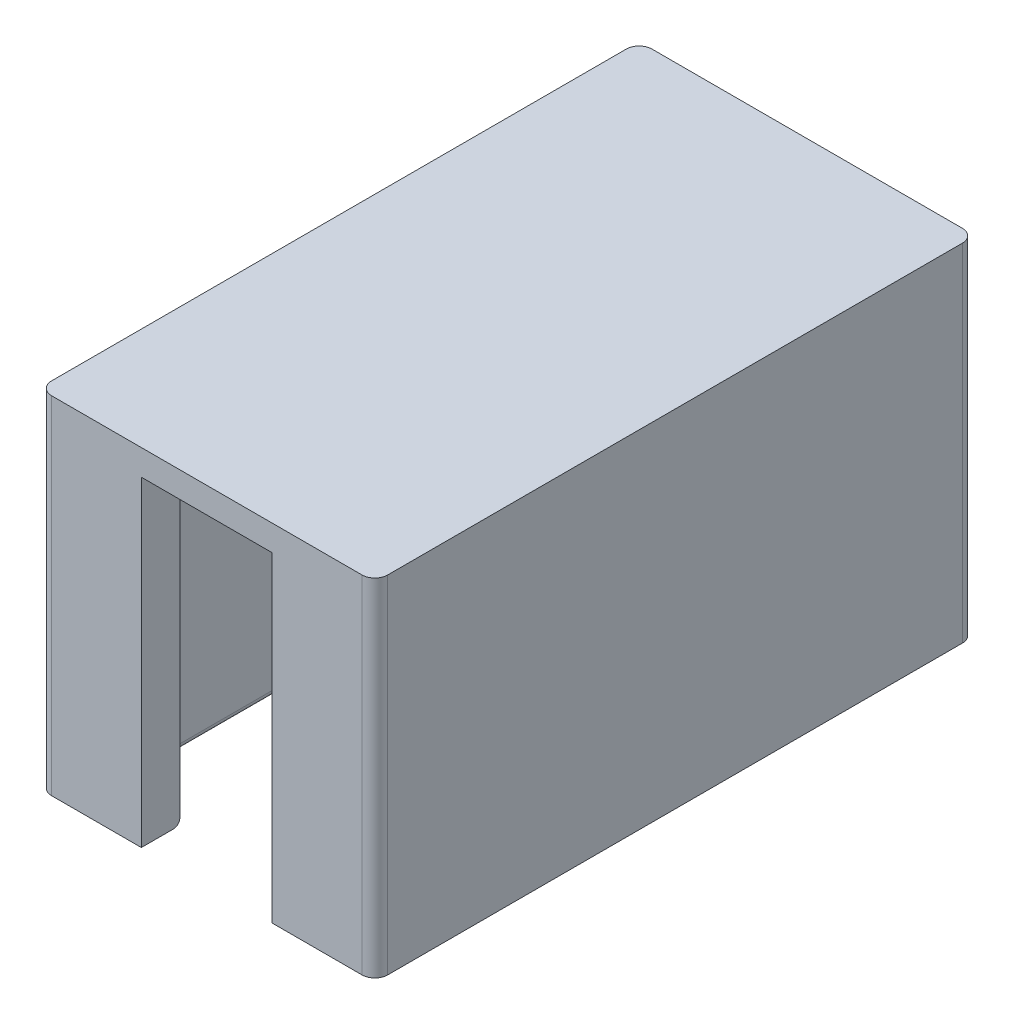
ISO-10303-21;
HEADER;
FILE_DESCRIPTION(('STEP AP214'),'2;1');
FILE_NAME('part.step','',(''),(''),'','','');
FILE_SCHEMA(('AUTOMOTIVE_DESIGN { 1 0 10303 214 1 1 1 1 }'));
ENDSEC;
DATA;
#1=APPLICATION_CONTEXT('core data for automotive mechanical design processes');
#2=APPLICATION_PROTOCOL_DEFINITION('international standard','automotive_design',2000,#1);
#3=PRODUCT_CONTEXT('',#1,'mechanical');
#4=PRODUCT('Part','Part','',(#3));
#5=PRODUCT_RELATED_PRODUCT_CATEGORY('part','',(#4));
#6=PRODUCT_DEFINITION_FORMATION('','',#4);
#7=PRODUCT_DEFINITION_CONTEXT('part definition',#1,'design');
#8=PRODUCT_DEFINITION('design','',#6,#7);
#9=PRODUCT_DEFINITION_SHAPE('','',#8);
#10=(LENGTH_UNIT() NAMED_UNIT(*) SI_UNIT(.MILLI.,.METRE.));
#11=(NAMED_UNIT(*) PLANE_ANGLE_UNIT() SI_UNIT($,.RADIAN.));
#12=(NAMED_UNIT(*) SI_UNIT($,.STERADIAN.) SOLID_ANGLE_UNIT());
#13=UNCERTAINTY_MEASURE_WITH_UNIT(LENGTH_MEASURE(1.E-05),#10,'distance_accuracy_value','');
#14=(GEOMETRIC_REPRESENTATION_CONTEXT(3) GLOBAL_UNCERTAINTY_ASSIGNED_CONTEXT((#13)) GLOBAL_UNIT_ASSIGNED_CONTEXT((#10,
#11,#12)) REPRESENTATION_CONTEXT('',''));
#15=CARTESIAN_POINT('',(0.,0.,0.));
#16=DIRECTION('',(0.,0.,1.));
#17=DIRECTION('',(1.,0.,0.));
#18=AXIS2_PLACEMENT_3D('',#15,#16,#17);
#19=CARTESIAN_POINT('',(3.,25.,-3.));
#20=DIRECTION('',(0.,0.,-1.));
#21=DIRECTION('',(-1.,0.,0.));
#22=AXIS2_PLACEMENT_3D('',#19,#20,#21);
#23=PLANE('',#22);
#24=DIRECTION('',(0.,-1.,0.));
#25=VECTOR('',#24,1.);
#26=CARTESIAN_POINT('',(3.,25.,-3.));
#27=LINE('',#26,#25);
#28=CARTESIAN_POINT('',(3.,24.5,-3.));
#29=VERTEX_POINT('',#28);
#30=CARTESIAN_POINT('',(3.,0.5,-3.));
#31=VERTEX_POINT('',#30);
#32=EDGE_CURVE('E386',#29,#31,#27,.T.);
#33=ORIENTED_EDGE('',*,*,#32,.F.);
#34=DIRECTION('',(1.,0.,0.));
#35=VECTOR('',#34,1.);
#36=CARTESIAN_POINT('',(8.,24.5,-3.));
#37=LINE('',#36,#35);
#38=CARTESIAN_POINT('',(8.,24.5,-3.));
#39=VERTEX_POINT('',#38);
#40=EDGE_CURVE('E197',#29,#39,#37,.T.);
#41=ORIENTED_EDGE('',*,*,#40,.T.);
#42=DIRECTION('',(0.,-1.,0.));
#43=VECTOR('',#42,1.);
#44=CARTESIAN_POINT('',(8.,25.,-3.));
#45=LINE('',#44,#43);
#46=CARTESIAN_POINT('',(8.,0.5,-3.));
#47=VERTEX_POINT('',#46);
#48=EDGE_CURVE('E327',#39,#47,#45,.T.);
#49=ORIENTED_EDGE('',*,*,#48,.T.);
#50=DIRECTION('',(1.,0.,0.));
#51=VECTOR('',#50,1.);
#52=CARTESIAN_POINT('',(3.,0.5,-3.));
#53=LINE('',#52,#51);
#54=EDGE_CURVE('E333',#47,#31,#53,.F.);
#55=ORIENTED_EDGE('',*,*,#54,.T.);
#56=EDGE_LOOP('',(#33,#41,#49,#55));
#57=FACE_BOUND('',#56,.T.);
#58=ADVANCED_FACE('F40',(#57),#23,.T.);
#59=CARTESIAN_POINT('',(0.,0.,0.));
#60=DIRECTION('',(0.,-1.,0.));
#61=DIRECTION('',(0.,0.,-1.));
#62=AXIS2_PLACEMENT_3D('',#59,#60,#61);
#63=PLANE('',#62);
#64=DIRECTION('',(-1.,0.,0.));
#65=VECTOR('',#64,1.);
#66=CARTESIAN_POINT('',(0.,0.,-46.8));
#67=LINE('',#66,#65);
#68=CARTESIAN_POINT('',(25.2,0.,-46.8));
#69=VERTEX_POINT('',#68);
#70=CARTESIAN_POINT('',(1.,0.,-46.8));
#71=VERTEX_POINT('',#70);
#72=EDGE_CURVE('E319',#69,#71,#67,.T.);
#73=ORIENTED_EDGE('',*,*,#72,.F.);
#74=CARTESIAN_POINT('',(25.2,0.,-45.8));
#75=DIRECTION('',(0.,-1.,0.));
#76=DIRECTION('',(0.,0.,-1.));
#77=AXIS2_PLACEMENT_3D('',#74,#75,#76);
#78=CIRCLE('',#77,1.);
#79=CARTESIAN_POINT('',(26.2,0.,-45.8));
#80=VERTEX_POINT('',#79);
#81=EDGE_CURVE('E280',#69,#80,#78,.T.);
#82=ORIENTED_EDGE('',*,*,#81,.T.);
#83=DIRECTION('',(0.,0.,-1.));
#84=VECTOR('',#83,1.);
#85=CARTESIAN_POINT('',(26.2,0.,0.));
#86=LINE('',#85,#84);
#87=CARTESIAN_POINT('',(26.2,0.,-1.));
#88=VERTEX_POINT('',#87);
#89=EDGE_CURVE('E315',#88,#80,#86,.T.);
#90=ORIENTED_EDGE('',*,*,#89,.F.);
#91=CARTESIAN_POINT('',(25.2,0.,-1.));
#92=DIRECTION('',(0.,-1.,0.));
#93=DIRECTION('',(0.,0.,-1.));
#94=AXIS2_PLACEMENT_3D('',#91,#92,#93);
#95=CIRCLE('',#94,1.);
#96=CARTESIAN_POINT('',(25.2,0.,0.));
#97=VERTEX_POINT('',#96);
#98=EDGE_CURVE('E276',#88,#97,#95,.T.);
#99=ORIENTED_EDGE('',*,*,#98,.T.);
#100=DIRECTION('',(1.,0.,0.));
#101=VECTOR('',#100,1.);
#102=CARTESIAN_POINT('',(0.,0.,0.));
#103=LINE('',#102,#101);
#104=CARTESIAN_POINT('',(18.2,0.,0.));
#105=VERTEX_POINT('',#104);
#106=EDGE_CURVE('E316',#105,#97,#103,.T.);
#107=ORIENTED_EDGE('',*,*,#106,.F.);
#108=DIRECTION('',(0.,0.,1.));
#109=VECTOR('',#108,1.);
#110=CARTESIAN_POINT('',(18.2,0.,-10.));
#111=LINE('',#110,#109);
#112=CARTESIAN_POINT('',(18.2,0.,-2.5));
#113=VERTEX_POINT('',#112);
#114=EDGE_CURVE('E363',#113,#105,#111,.T.);
#115=ORIENTED_EDGE('',*,*,#114,.F.);
#116=DIRECTION('',(1.,0.,0.));
#117=VECTOR('',#116,1.);
#118=CARTESIAN_POINT('',(0.,0.,-2.5));
#119=LINE('',#118,#117);
#120=CARTESIAN_POINT('',(23.7,0.,-2.5));
#121=VERTEX_POINT('',#120);
#122=EDGE_CURVE('E238',#113,#121,#119,.T.);
#123=ORIENTED_EDGE('',*,*,#122,.T.);
#124=DIRECTION('',(0.,0.,-1.));
#125=VECTOR('',#124,1.);
#126=CARTESIAN_POINT('',(23.7,0.,0.));
#127=LINE('',#126,#125);
#128=CARTESIAN_POINT('',(23.7,0.,-44.3));
#129=VERTEX_POINT('',#128);
#130=EDGE_CURVE('E240',#121,#129,#127,.T.);
#131=ORIENTED_EDGE('',*,*,#130,.T.);
#132=DIRECTION('',(-1.,0.,0.));
#133=VECTOR('',#132,1.);
#134=CARTESIAN_POINT('',(0.,0.,-44.3));
#135=LINE('',#134,#133);
#136=CARTESIAN_POINT('',(2.5,0.,-44.3));
#137=VERTEX_POINT('',#136);
#138=EDGE_CURVE('E242',#129,#137,#135,.T.);
#139=ORIENTED_EDGE('',*,*,#138,.T.);
#140=DIRECTION('',(0.,0.,1.));
#141=VECTOR('',#140,1.);
#142=CARTESIAN_POINT('',(2.5,0.,0.));
#143=LINE('',#142,#141);
#144=CARTESIAN_POINT('',(2.5,0.,-2.5));
#145=VERTEX_POINT('',#144);
#146=EDGE_CURVE('E244',#137,#145,#143,.T.);
#147=ORIENTED_EDGE('',*,*,#146,.T.);
#148=DIRECTION('',(1.,0.,0.));
#149=VECTOR('',#148,1.);
#150=CARTESIAN_POINT('',(0.,0.,-2.5));
#151=LINE('',#150,#149);
#152=CARTESIAN_POINT('',(8.,0.,-2.5));
#153=VERTEX_POINT('',#152);
#154=EDGE_CURVE('E246',#145,#153,#151,.T.);
#155=ORIENTED_EDGE('',*,*,#154,.T.);
#156=DIRECTION('',(0.,0.,1.));
#157=VECTOR('',#156,1.);
#158=CARTESIAN_POINT('',(8.,0.,-10.));
#159=LINE('',#158,#157);
#160=CARTESIAN_POINT('',(8.,0.,0.));
#161=VERTEX_POINT('',#160);
#162=EDGE_CURVE('E313',#153,#161,#159,.T.);
#163=ORIENTED_EDGE('',*,*,#162,.T.);
#164=CARTESIAN_POINT('',(1.,0.,0.));
#165=VERTEX_POINT('',#164);
#166=EDGE_CURVE('E303',#165,#161,#103,.T.);
#167=ORIENTED_EDGE('',*,*,#166,.F.);
#168=CARTESIAN_POINT('',(1.,0.,-1.));
#169=DIRECTION('',(0.,-1.,0.));
#170=DIRECTION('',(0.,0.,-1.));
#171=AXIS2_PLACEMENT_3D('',#168,#169,#170);
#172=CIRCLE('',#171,1.);
#173=CARTESIAN_POINT('',(0.,0.,-1.));
#174=VERTEX_POINT('',#173);
#175=EDGE_CURVE('E274',#165,#174,#172,.T.);
#176=ORIENTED_EDGE('',*,*,#175,.T.);
#177=DIRECTION('',(0.,0.,1.));
#178=VECTOR('',#177,1.);
#179=CARTESIAN_POINT('',(0.,0.,0.));
#180=LINE('',#179,#178);
#181=CARTESIAN_POINT('',(0.,0.,-45.8));
#182=VERTEX_POINT('',#181);
#183=EDGE_CURVE('E321',#182,#174,#180,.T.);
#184=ORIENTED_EDGE('',*,*,#183,.F.);
#185=CARTESIAN_POINT('',(1.,0.,-45.8));
#186=DIRECTION('',(0.,-1.,0.));
#187=DIRECTION('',(0.,0.,-1.));
#188=AXIS2_PLACEMENT_3D('',#185,#186,#187);
#189=CIRCLE('',#188,1.);
#190=EDGE_CURVE('E278',#182,#71,#189,.T.);
#191=ORIENTED_EDGE('',*,*,#190,.T.);
#192=EDGE_LOOP('',(#73,#82,#90,#99,#107,#115,#123,#131,#139,#147,#155,#163,#167,#176,#184,#191));
#193=FACE_BOUND('',#192,.T.);
#194=ADVANCED_FACE('F309',(#193),#63,.T.);
#195=CARTESIAN_POINT('',(0.,25.,0.));
#196=DIRECTION('',(1.,0.,0.));
#197=DIRECTION('',(0.,0.,-1.));
#198=AXIS2_PLACEMENT_3D('',#195,#196,#197);
#199=PLANE('',#198);
#200=DIRECTION('',(0.,0.,1.));
#201=VECTOR('',#200,1.);
#202=CARTESIAN_POINT('',(0.,27.,0.));
#203=LINE('',#202,#201);
#204=CARTESIAN_POINT('',(0.,27.,-45.8));
#205=VERTEX_POINT('',#204);
#206=CARTESIAN_POINT('',(0.,27.,-1.));
#207=VERTEX_POINT('',#206);
#208=EDGE_CURVE('E368',#205,#207,#203,.T.);
#209=ORIENTED_EDGE('',*,*,#208,.F.);
#210=DIRECTION('',(0.,-1.,0.));
#211=VECTOR('',#210,1.);
#212=CARTESIAN_POINT('',(0.,25.,-45.8));
#213=LINE('',#212,#211);
#214=EDGE_CURVE('E296',#205,#182,#213,.T.);
#215=ORIENTED_EDGE('',*,*,#214,.T.);
#216=ORIENTED_EDGE('',*,*,#183,.T.);
#217=DIRECTION('',(0.,-1.,0.));
#218=VECTOR('',#217,1.);
#219=CARTESIAN_POINT('',(0.,25.,-1.));
#220=LINE('',#219,#218);
#221=EDGE_CURVE('E294',#174,#207,#220,.F.);
#222=ORIENTED_EDGE('',*,*,#221,.T.);
#223=EDGE_LOOP('',(#209,#215,#216,#222));
#224=FACE_BOUND('',#223,.T.);
#225=ADVANCED_FACE('F394',(#224),#199,.F.);
#226=CARTESIAN_POINT('',(0.,25.,0.));
#227=DIRECTION('',(0.,0.,-1.));
#228=DIRECTION('',(-1.,0.,0.));
#229=AXIS2_PLACEMENT_3D('',#226,#227,#228);
#230=PLANE('',#229);
#231=ORIENTED_EDGE('',*,*,#106,.T.);
#232=DIRECTION('',(0.,-1.,0.));
#233=VECTOR('',#232,1.);
#234=CARTESIAN_POINT('',(25.2,25.,0.));
#235=LINE('',#234,#233);
#236=CARTESIAN_POINT('',(25.2,27.,0.));
#237=VERTEX_POINT('',#236);
#238=EDGE_CURVE('E11',#97,#237,#235,.F.);
#239=ORIENTED_EDGE('',*,*,#238,.T.);
#240=DIRECTION('',(1.,0.,0.));
#241=VECTOR('',#240,1.);
#242=CARTESIAN_POINT('',(0.,27.,0.));
#243=LINE('',#242,#241);
#244=CARTESIAN_POINT('',(1.,27.,0.));
#245=VERTEX_POINT('',#244);
#246=EDGE_CURVE('E305',#245,#237,#243,.T.);
#247=ORIENTED_EDGE('',*,*,#246,.F.);
#248=DIRECTION('',(0.,-1.,0.));
#249=VECTOR('',#248,1.);
#250=CARTESIAN_POINT('',(1.,25.,0.));
#251=LINE('',#250,#249);
#252=EDGE_CURVE('E48',#245,#165,#251,.T.);
#253=ORIENTED_EDGE('',*,*,#252,.T.);
#254=ORIENTED_EDGE('',*,*,#166,.T.);
#255=DIRECTION('',(0.,1.,0.));
#256=VECTOR('',#255,1.);
#257=CARTESIAN_POINT('',(8.,0.,0.));
#258=LINE('',#257,#256);
#259=CARTESIAN_POINT('',(8.,25.,0.));
#260=VERTEX_POINT('',#259);
#261=EDGE_CURVE('E367',#161,#260,#258,.T.);
#262=ORIENTED_EDGE('',*,*,#261,.T.);
#263=DIRECTION('',(1.,0.,0.));
#264=VECTOR('',#263,1.);
#265=CARTESIAN_POINT('',(0.,25.,0.));
#266=LINE('',#265,#264);
#267=CARTESIAN_POINT('',(18.2,25.,0.));
#268=VERTEX_POINT('',#267);
#269=EDGE_CURVE('E360',#260,#268,#266,.T.);
#270=ORIENTED_EDGE('',*,*,#269,.T.);
#271=DIRECTION('',(0.,1.,0.));
#272=VECTOR('',#271,1.);
#273=CARTESIAN_POINT('',(18.2,0.,0.));
#274=LINE('',#273,#272);
#275=EDGE_CURVE('E257',#105,#268,#274,.T.);
#276=ORIENTED_EDGE('',*,*,#275,.F.);
#277=EDGE_LOOP('',(#231,#239,#247,#253,#254,#262,#270,#276));
#278=FACE_BOUND('',#277,.T.);
#279=ADVANCED_FACE('F301',(#278),#230,.F.);
#280=CARTESIAN_POINT('',(26.2,25.,0.));
#281=DIRECTION('',(-1.,0.,0.));
#282=DIRECTION('',(0.,0.,1.));
#283=AXIS2_PLACEMENT_3D('',#280,#281,#282);
#284=PLANE('',#283);
#285=ORIENTED_EDGE('',*,*,#89,.T.);
#286=DIRECTION('',(0.,-1.,0.));
#287=VECTOR('',#286,1.);
#288=CARTESIAN_POINT('',(26.2,25.,-45.8));
#289=LINE('',#288,#287);
#290=CARTESIAN_POINT('',(26.2,27.,-45.8));
#291=VERTEX_POINT('',#290);
#292=EDGE_CURVE('E285',#80,#291,#289,.F.);
#293=ORIENTED_EDGE('',*,*,#292,.T.);
#294=DIRECTION('',(0.,0.,-1.));
#295=VECTOR('',#294,1.);
#296=CARTESIAN_POINT('',(26.2,27.,0.));
#297=LINE('',#296,#295);
#298=CARTESIAN_POINT('',(26.2,27.,-1.));
#299=VERTEX_POINT('',#298);
#300=EDGE_CURVE('E442',#299,#291,#297,.T.);
#301=ORIENTED_EDGE('',*,*,#300,.F.);
#302=DIRECTION('',(0.,-1.,0.));
#303=VECTOR('',#302,1.);
#304=CARTESIAN_POINT('',(26.2,25.,-1.));
#305=LINE('',#304,#303);
#306=EDGE_CURVE('E282',#299,#88,#305,.T.);
#307=ORIENTED_EDGE('',*,*,#306,.T.);
#308=EDGE_LOOP('',(#285,#293,#301,#307));
#309=FACE_BOUND('',#308,.T.);
#310=ADVANCED_FACE('F445',(#309),#284,.F.);
#311=CARTESIAN_POINT('',(0.,25.,-46.8));
#312=DIRECTION('',(0.,0.,1.));
#313=DIRECTION('',(1.,0.,0.));
#314=AXIS2_PLACEMENT_3D('',#311,#312,#313);
#315=PLANE('',#314);
#316=DIRECTION('',(-1.,0.,0.));
#317=VECTOR('',#316,1.);
#318=CARTESIAN_POINT('',(0.,27.,-46.8));
#319=LINE('',#318,#317);
#320=CARTESIAN_POINT('',(25.2,27.,-46.8));
#321=VERTEX_POINT('',#320);
#322=CARTESIAN_POINT('',(1.,27.,-46.8));
#323=VERTEX_POINT('',#322);
#324=EDGE_CURVE('E262',#321,#323,#319,.T.);
#325=ORIENTED_EDGE('',*,*,#324,.F.);
#326=DIRECTION('',(0.,-1.,0.));
#327=VECTOR('',#326,1.);
#328=CARTESIAN_POINT('',(25.2,25.,-46.8));
#329=LINE('',#328,#327);
#330=EDGE_CURVE('E271',#321,#69,#329,.T.);
#331=ORIENTED_EDGE('',*,*,#330,.T.);
#332=ORIENTED_EDGE('',*,*,#72,.T.);
#333=DIRECTION('',(0.,-1.,0.));
#334=VECTOR('',#333,1.);
#335=CARTESIAN_POINT('',(1.,25.,-46.8));
#336=LINE('',#335,#334);
#337=EDGE_CURVE('E248',#71,#323,#336,.F.);
#338=ORIENTED_EDGE('',*,*,#337,.T.);
#339=EDGE_LOOP('',(#325,#331,#332,#338));
#340=FACE_BOUND('',#339,.T.);
#341=ADVANCED_FACE('F423',(#340),#315,.F.);
#342=CARTESIAN_POINT('',(3.,25.,-3.));
#343=DIRECTION('',(1.,0.,0.));
#344=DIRECTION('',(0.,0.,-1.));
#345=AXIS2_PLACEMENT_3D('',#342,#343,#344);
#346=PLANE('',#345);
#347=DIRECTION('',(0.,-1.,0.));
#348=VECTOR('',#347,1.);
#349=CARTESIAN_POINT('',(3.,25.,-43.8));
#350=LINE('',#349,#348);
#351=CARTESIAN_POINT('',(3.,24.5,-43.8));
#352=VERTEX_POINT('',#351);
#353=CARTESIAN_POINT('',(3.,0.5,-43.8));
#354=VERTEX_POINT('',#353);
#355=EDGE_CURVE('E362',#352,#354,#350,.T.);
#356=ORIENTED_EDGE('',*,*,#355,.F.);
#357=DIRECTION('',(0.,0.,1.));
#358=VECTOR('',#357,1.);
#359=CARTESIAN_POINT('',(3.,24.5,-3.));
#360=LINE('',#359,#358);
#361=EDGE_CURVE('E217',#352,#29,#360,.T.);
#362=ORIENTED_EDGE('',*,*,#361,.T.);
#363=ORIENTED_EDGE('',*,*,#32,.T.);
#364=DIRECTION('',(0.,0.,1.));
#365=VECTOR('',#364,1.);
#366=CARTESIAN_POINT('',(3.,0.5,-3.));
#367=LINE('',#366,#365);
#368=EDGE_CURVE('E215',#31,#354,#367,.F.);
#369=ORIENTED_EDGE('',*,*,#368,.T.);
#370=EDGE_LOOP('',(#356,#362,#363,#369));
#371=FACE_BOUND('',#370,.T.);
#372=ADVANCED_FACE('F415',(#371),#346,.T.);
#373=DIRECTION('',(0.,-1.,0.));
#374=VECTOR('',#373,1.);
#375=CARTESIAN_POINT('',(18.2,25.,-3.));
#376=LINE('',#375,#374);
#377=CARTESIAN_POINT('',(18.2,24.5,-3.));
#378=VERTEX_POINT('',#377);
#379=CARTESIAN_POINT('',(18.2,0.5,-3.));
#380=VERTEX_POINT('',#379);
#381=EDGE_CURVE('E330',#378,#380,#376,.T.);
#382=ORIENTED_EDGE('',*,*,#381,.F.);
#383=DIRECTION('',(1.,0.,0.));
#384=VECTOR('',#383,1.);
#385=CARTESIAN_POINT('',(23.2,24.5,-3.));
#386=LINE('',#385,#384);
#387=CARTESIAN_POINT('',(23.2,24.5,-3.));
#388=VERTEX_POINT('',#387);
#389=EDGE_CURVE('E228',#378,#388,#386,.T.);
#390=ORIENTED_EDGE('',*,*,#389,.T.);
#391=DIRECTION('',(0.,-1.,0.));
#392=VECTOR('',#391,1.);
#393=CARTESIAN_POINT('',(23.2,25.,-3.));
#394=LINE('',#393,#392);
#395=CARTESIAN_POINT('',(23.2,0.5,-3.));
#396=VERTEX_POINT('',#395);
#397=EDGE_CURVE('E384',#388,#396,#394,.T.);
#398=ORIENTED_EDGE('',*,*,#397,.T.);
#399=DIRECTION('',(1.,0.,0.));
#400=VECTOR('',#399,1.);
#401=CARTESIAN_POINT('',(3.,0.5,-3.));
#402=LINE('',#401,#400);
#403=EDGE_CURVE('E226',#396,#380,#402,.F.);
#404=ORIENTED_EDGE('',*,*,#403,.T.);
#405=EDGE_LOOP('',(#382,#390,#398,#404));
#406=FACE_BOUND('',#405,.T.);
#407=ADVANCED_FACE('F406',(#406),#23,.T.);
#408=CARTESIAN_POINT('',(23.2,25.,-3.));
#409=DIRECTION('',(-1.,0.,0.));
#410=DIRECTION('',(0.,0.,1.));
#411=AXIS2_PLACEMENT_3D('',#408,#409,#410);
#412=PLANE('',#411);
#413=ORIENTED_EDGE('',*,*,#397,.F.);
#414=DIRECTION('',(0.,0.,-1.));
#415=VECTOR('',#414,1.);
#416=CARTESIAN_POINT('',(23.2,24.5,-43.8));
#417=LINE('',#416,#415);
#418=CARTESIAN_POINT('',(23.2,24.5,-43.8));
#419=VERTEX_POINT('',#418);
#420=EDGE_CURVE('E236',#388,#419,#417,.T.);
#421=ORIENTED_EDGE('',*,*,#420,.T.);
#422=DIRECTION('',(0.,-1.,0.));
#423=VECTOR('',#422,1.);
#424=CARTESIAN_POINT('',(23.2,25.,-43.8));
#425=LINE('',#424,#423);
#426=CARTESIAN_POINT('',(23.2,0.5,-43.8));
#427=VERTEX_POINT('',#426);
#428=EDGE_CURVE('E381',#419,#427,#425,.T.);
#429=ORIENTED_EDGE('',*,*,#428,.T.);
#430=DIRECTION('',(0.,0.,-1.));
#431=VECTOR('',#430,1.);
#432=CARTESIAN_POINT('',(23.2,0.5,-3.));
#433=LINE('',#432,#431);
#434=EDGE_CURVE('E234',#427,#396,#433,.F.);
#435=ORIENTED_EDGE('',*,*,#434,.T.);
#436=EDGE_LOOP('',(#413,#421,#429,#435));
#437=FACE_BOUND('',#436,.T.);
#438=ADVANCED_FACE('F414',(#437),#412,.T.);
#439=CARTESIAN_POINT('',(3.,25.,-43.8));
#440=DIRECTION('',(0.,0.,1.));
#441=DIRECTION('',(1.,0.,0.));
#442=AXIS2_PLACEMENT_3D('',#439,#440,#441);
#443=PLANE('',#442);
#444=ORIENTED_EDGE('',*,*,#428,.F.);
#445=DIRECTION('',(-1.,0.,0.));
#446=VECTOR('',#445,1.);
#447=CARTESIAN_POINT('',(3.,24.5,-43.8));
#448=LINE('',#447,#446);
#449=EDGE_CURVE('E224',#419,#352,#448,.T.);
#450=ORIENTED_EDGE('',*,*,#449,.T.);
#451=ORIENTED_EDGE('',*,*,#355,.T.);
#452=DIRECTION('',(-1.,0.,0.));
#453=VECTOR('',#452,1.);
#454=CARTESIAN_POINT('',(3.,0.5,-43.8));
#455=LINE('',#454,#453);
#456=EDGE_CURVE('E222',#354,#427,#455,.F.);
#457=ORIENTED_EDGE('',*,*,#456,.T.);
#458=EDGE_LOOP('',(#444,#450,#451,#457));
#459=FACE_BOUND('',#458,.T.);
#460=ADVANCED_FACE('F421',(#459),#443,.T.);
#461=CARTESIAN_POINT('',(8.,0.,-10.));
#462=DIRECTION('',(1.,0.,0.));
#463=DIRECTION('',(0.,0.,-1.));
#464=AXIS2_PLACEMENT_3D('',#461,#462,#463);
#465=PLANE('',#464);
#466=ORIENTED_EDGE('',*,*,#48,.F.);
#467=CARTESIAN_POINT('',(8.,24.5,-2.5));
#468=DIRECTION('',(1.,0.,0.));
#469=DIRECTION('',(0.,0.,-1.));
#470=AXIS2_PLACEMENT_3D('',#467,#468,#469);
#471=CIRCLE('',#470,0.5);
#472=CARTESIAN_POINT('',(8.,25.,-2.5));
#473=VERTEX_POINT('',#472);
#474=EDGE_CURVE('E338',#39,#473,#471,.T.);
#475=ORIENTED_EDGE('',*,*,#474,.T.);
#476=DIRECTION('',(0.,0.,1.));
#477=VECTOR('',#476,1.);
#478=CARTESIAN_POINT('',(8.,25.,-10.));
#479=LINE('',#478,#477);
#480=EDGE_CURVE('E214',#473,#260,#479,.T.);
#481=ORIENTED_EDGE('',*,*,#480,.T.);
#482=ORIENTED_EDGE('',*,*,#261,.F.);
#483=ORIENTED_EDGE('',*,*,#162,.F.);
#484=CARTESIAN_POINT('',(8.,0.5,-2.5));
#485=DIRECTION('',(1.,0.,0.));
#486=DIRECTION('',(0.,0.,-1.));
#487=AXIS2_PLACEMENT_3D('',#484,#485,#486);
#488=CIRCLE('',#487,0.5);
#489=EDGE_CURVE('E336',#153,#47,#488,.T.);
#490=ORIENTED_EDGE('',*,*,#489,.T.);
#491=EDGE_LOOP('',(#466,#475,#481,#482,#483,#490));
#492=FACE_BOUND('',#491,.T.);
#493=ADVANCED_FACE('F535',(#492),#465,.T.);
#494=CARTESIAN_POINT('',(18.2,0.,-10.));
#495=DIRECTION('',(1.,0.,0.));
#496=DIRECTION('',(0.,0.,-1.));
#497=AXIS2_PLACEMENT_3D('',#494,#495,#496);
#498=PLANE('',#497);
#499=DIRECTION('',(0.,0.,1.));
#500=VECTOR('',#499,1.);
#501=CARTESIAN_POINT('',(18.2,25.,-10.));
#502=LINE('',#501,#500);
#503=CARTESIAN_POINT('',(18.2,25.,-2.5));
#504=VERTEX_POINT('',#503);
#505=EDGE_CURVE('E358',#504,#268,#502,.T.);
#506=ORIENTED_EDGE('',*,*,#505,.F.);
#507=CARTESIAN_POINT('',(18.2,24.5,-2.5));
#508=DIRECTION('',(1.,0.,0.));
#509=DIRECTION('',(0.,0.,-1.));
#510=AXIS2_PLACEMENT_3D('',#507,#508,#509);
#511=CIRCLE('',#510,0.5);
#512=EDGE_CURVE('E232',#504,#378,#511,.F.);
#513=ORIENTED_EDGE('',*,*,#512,.T.);
#514=ORIENTED_EDGE('',*,*,#381,.T.);
#515=CARTESIAN_POINT('',(18.2,0.5,-2.5));
#516=DIRECTION('',(1.,0.,0.));
#517=DIRECTION('',(0.,0.,-1.));
#518=AXIS2_PLACEMENT_3D('',#515,#516,#517);
#519=CIRCLE('',#518,0.5);
#520=EDGE_CURVE('E230',#380,#113,#519,.F.);
#521=ORIENTED_EDGE('',*,*,#520,.T.);
#522=ORIENTED_EDGE('',*,*,#114,.T.);
#523=ORIENTED_EDGE('',*,*,#275,.T.);
#524=EDGE_LOOP('',(#506,#513,#514,#521,#522,#523));
#525=FACE_BOUND('',#524,.T.);
#526=ADVANCED_FACE('F428',(#525),#498,.F.);
#527=CARTESIAN_POINT('',(3.,24.5,-2.5));
#528=DIRECTION('',(-1.,0.,0.));
#529=DIRECTION('',(0.,0.,1.));
#530=AXIS2_PLACEMENT_3D('',#527,#528,#529);
#531=CYLINDRICAL_SURFACE('',#530,0.5);
#532=ORIENTED_EDGE('',*,*,#512,.F.);
#533=DIRECTION('',(1.,0.,0.));
#534=VECTOR('',#533,1.);
#535=CARTESIAN_POINT('',(18.2,25.,-2.5));
#536=LINE('',#535,#534);
#537=CARTESIAN_POINT('',(23.7,25.,-2.5));
#538=VERTEX_POINT('',#537);
#539=EDGE_CURVE('E343',#538,#504,#536,.F.);
#540=ORIENTED_EDGE('',*,*,#539,.F.);
#541=CARTESIAN_POINT('',(23.7,24.5,-2.5));
#542=DIRECTION('',(-0.707106781186547,0.,0.707106781186547));
#543=DIRECTION('',(-0.707106781186547,0.,-0.707106781186547));
#544=AXIS2_PLACEMENT_3D('',#541,#542,#543);
#545=ELLIPSE('',#544,0.707106781186547,0.5);
#546=EDGE_CURVE('E254',#388,#538,#545,.F.);
#547=ORIENTED_EDGE('',*,*,#546,.F.);
#548=ORIENTED_EDGE('',*,*,#389,.F.);
#549=EDGE_LOOP('',(#532,#540,#547,#548));
#550=FACE_BOUND('',#549,.T.);
#551=ADVANCED_FACE('F356',(#550),#531,.T.);
#552=CARTESIAN_POINT('',(23.7,24.5,-3.));
#553=DIRECTION('',(0.,0.,1.));
#554=DIRECTION('',(1.,0.,0.));
#555=AXIS2_PLACEMENT_3D('',#552,#553,#554);
#556=CYLINDRICAL_SURFACE('',#555,0.5);
#557=ORIENTED_EDGE('',*,*,#546,.T.);
#558=DIRECTION('',(0.,0.,-1.));
#559=VECTOR('',#558,1.);
#560=CARTESIAN_POINT('',(23.7,25.,-3.));
#561=LINE('',#560,#559);
#562=CARTESIAN_POINT('',(23.7,25.,-44.3));
#563=VERTEX_POINT('',#562);
#564=EDGE_CURVE('E340',#563,#538,#561,.F.);
#565=ORIENTED_EDGE('',*,*,#564,.F.);
#566=CARTESIAN_POINT('',(23.7,24.5,-44.3));
#567=DIRECTION('',(0.707106781186547,0.,0.707106781186547));
#568=DIRECTION('',(0.707106781186547,0.,-0.707106781186547));
#569=AXIS2_PLACEMENT_3D('',#566,#567,#568);
#570=ELLIPSE('',#569,0.707106781186547,0.5);
#571=EDGE_CURVE('E251',#419,#563,#570,.F.);
#572=ORIENTED_EDGE('',*,*,#571,.F.);
#573=ORIENTED_EDGE('',*,*,#420,.F.);
#574=EDGE_LOOP('',(#557,#565,#572,#573));
#575=FACE_BOUND('',#574,.T.);
#576=ADVANCED_FACE('F351',(#575),#556,.T.);
#577=CARTESIAN_POINT('',(3.,24.5,-44.3));
#578=DIRECTION('',(1.,0.,0.));
#579=DIRECTION('',(0.,0.,-1.));
#580=AXIS2_PLACEMENT_3D('',#577,#578,#579);
#581=CYLINDRICAL_SURFACE('',#580,0.5);
#582=ORIENTED_EDGE('',*,*,#571,.T.);
#583=DIRECTION('',(-1.,0.,0.));
#584=VECTOR('',#583,1.);
#585=CARTESIAN_POINT('',(23.2,25.,-44.3));
#586=LINE('',#585,#584);
#587=CARTESIAN_POINT('',(2.5,25.,-44.3));
#588=VERTEX_POINT('',#587);
#589=EDGE_CURVE('E210',#588,#563,#586,.F.);
#590=ORIENTED_EDGE('',*,*,#589,.F.);
#591=CARTESIAN_POINT('',(2.5,24.5,-44.3));
#592=DIRECTION('',(0.707106781186547,0.,-0.707106781186547));
#593=DIRECTION('',(-0.707106781186547,0.,-0.707106781186547));
#594=AXIS2_PLACEMENT_3D('',#591,#592,#593);
#595=ELLIPSE('',#594,0.707106781186547,0.5);
#596=EDGE_CURVE('E200',#352,#588,#595,.F.);
#597=ORIENTED_EDGE('',*,*,#596,.F.);
#598=ORIENTED_EDGE('',*,*,#449,.F.);
#599=EDGE_LOOP('',(#582,#590,#597,#598));
#600=FACE_BOUND('',#599,.T.);
#601=ADVANCED_FACE('F346',(#600),#581,.T.);
#602=CARTESIAN_POINT('',(2.5,24.5,-3.));
#603=DIRECTION('',(0.,0.,-1.));
#604=DIRECTION('',(-1.,0.,0.));
#605=AXIS2_PLACEMENT_3D('',#602,#603,#604);
#606=CYLINDRICAL_SURFACE('',#605,0.5);
#607=ORIENTED_EDGE('',*,*,#596,.T.);
#608=DIRECTION('',(0.,0.,1.));
#609=VECTOR('',#608,1.);
#610=CARTESIAN_POINT('',(2.5,25.,-43.8));
#611=LINE('',#610,#609);
#612=CARTESIAN_POINT('',(2.5,25.,-2.5));
#613=VERTEX_POINT('',#612);
#614=EDGE_CURVE('E205',#613,#588,#611,.F.);
#615=ORIENTED_EDGE('',*,*,#614,.F.);
#616=CARTESIAN_POINT('',(2.5,24.5,-2.5));
#617=DIRECTION('',(-0.707106781186547,0.,-0.707106781186547));
#618=DIRECTION('',(-0.707106781186547,0.,0.707106781186547));
#619=AXIS2_PLACEMENT_3D('',#616,#617,#618);
#620=ELLIPSE('',#619,0.707106781186547,0.5);
#621=EDGE_CURVE('E190',#29,#613,#620,.F.);
#622=ORIENTED_EDGE('',*,*,#621,.F.);
#623=ORIENTED_EDGE('',*,*,#361,.F.);
#624=EDGE_LOOP('',(#607,#615,#622,#623));
#625=FACE_BOUND('',#624,.T.);
#626=ADVANCED_FACE('F206',(#625),#606,.T.);
#627=CARTESIAN_POINT('',(3.,24.5,-2.5));
#628=DIRECTION('',(-1.,0.,0.));
#629=DIRECTION('',(0.,0.,1.));
#630=AXIS2_PLACEMENT_3D('',#627,#628,#629);
#631=CYLINDRICAL_SURFACE('',#630,0.5);
#632=ORIENTED_EDGE('',*,*,#621,.T.);
#633=DIRECTION('',(1.,0.,0.));
#634=VECTOR('',#633,1.);
#635=CARTESIAN_POINT('',(3.,25.,-2.5));
#636=LINE('',#635,#634);
#637=EDGE_CURVE('E194',#473,#613,#636,.F.);
#638=ORIENTED_EDGE('',*,*,#637,.F.);
#639=ORIENTED_EDGE('',*,*,#474,.F.);
#640=ORIENTED_EDGE('',*,*,#40,.F.);
#641=EDGE_LOOP('',(#632,#638,#639,#640));
#642=FACE_BOUND('',#641,.T.);
#643=ADVANCED_FACE('F192',(#642),#631,.T.);
#644=CARTESIAN_POINT('',(0.,0.5,-2.5));
#645=DIRECTION('',(1.,0.,0.));
#646=DIRECTION('',(0.,0.,-1.));
#647=AXIS2_PLACEMENT_3D('',#644,#645,#646);
#648=CYLINDRICAL_SURFACE('',#647,0.5);
#649=ORIENTED_EDGE('',*,*,#520,.F.);
#650=ORIENTED_EDGE('',*,*,#403,.F.);
#651=CARTESIAN_POINT('',(23.7,0.5,-2.5));
#652=DIRECTION('',(0.707106781186547,0.,-0.707106781186547));
#653=DIRECTION('',(-0.707106781186547,0.,-0.707106781186547));
#654=AXIS2_PLACEMENT_3D('',#651,#652,#653);
#655=ELLIPSE('',#654,0.707106781186547,0.5);
#656=EDGE_CURVE('E201',#121,#396,#655,.T.);
#657=ORIENTED_EDGE('',*,*,#656,.F.);
#658=ORIENTED_EDGE('',*,*,#122,.F.);
#659=EDGE_LOOP('',(#649,#650,#657,#658));
#660=FACE_BOUND('',#659,.T.);
#661=ADVANCED_FACE('F432',(#660),#648,.T.);
#662=CARTESIAN_POINT('',(23.7,0.5,0.));
#663=DIRECTION('',(0.,0.,-1.));
#664=DIRECTION('',(-1.,0.,0.));
#665=AXIS2_PLACEMENT_3D('',#662,#663,#664);
#666=CYLINDRICAL_SURFACE('',#665,0.5);
#667=ORIENTED_EDGE('',*,*,#656,.T.);
#668=ORIENTED_EDGE('',*,*,#434,.F.);
#669=CARTESIAN_POINT('',(23.7,0.5,-44.3));
#670=DIRECTION('',(-0.707106781186547,0.,-0.707106781186547));
#671=DIRECTION('',(-0.707106781186547,0.,0.707106781186547));
#672=AXIS2_PLACEMENT_3D('',#669,#670,#671);
#673=ELLIPSE('',#672,0.707106781186547,0.5);
#674=EDGE_CURVE('E265',#129,#427,#673,.T.);
#675=ORIENTED_EDGE('',*,*,#674,.F.);
#676=ORIENTED_EDGE('',*,*,#130,.F.);
#677=EDGE_LOOP('',(#667,#668,#675,#676));
#678=FACE_BOUND('',#677,.T.);
#679=ADVANCED_FACE('F468',(#678),#666,.T.);
#680=CARTESIAN_POINT('',(0.,0.5,-44.3));
#681=DIRECTION('',(-1.,0.,0.));
#682=DIRECTION('',(0.,0.,1.));
#683=AXIS2_PLACEMENT_3D('',#680,#681,#682);
#684=CYLINDRICAL_SURFACE('',#683,0.5);
#685=ORIENTED_EDGE('',*,*,#674,.T.);
#686=ORIENTED_EDGE('',*,*,#456,.F.);
#687=CARTESIAN_POINT('',(2.5,0.5,-44.3));
#688=DIRECTION('',(-0.707106781186547,0.,0.707106781186547));
#689=DIRECTION('',(0.707106781186547,0.,0.707106781186547));
#690=AXIS2_PLACEMENT_3D('',#687,#688,#689);
#691=ELLIPSE('',#690,0.707106781186547,0.5);
#692=EDGE_CURVE('E261',#137,#354,#691,.T.);
#693=ORIENTED_EDGE('',*,*,#692,.F.);
#694=ORIENTED_EDGE('',*,*,#138,.F.);
#695=EDGE_LOOP('',(#685,#686,#693,#694));
#696=FACE_BOUND('',#695,.T.);
#697=ADVANCED_FACE('F471',(#696),#684,.T.);
#698=CARTESIAN_POINT('',(2.5,0.5,0.));
#699=DIRECTION('',(0.,0.,1.));
#700=DIRECTION('',(1.,0.,0.));
#701=AXIS2_PLACEMENT_3D('',#698,#699,#700);
#702=CYLINDRICAL_SURFACE('',#701,0.5);
#703=ORIENTED_EDGE('',*,*,#692,.T.);
#704=ORIENTED_EDGE('',*,*,#368,.F.);
#705=CARTESIAN_POINT('',(2.5,0.5,-2.5));
#706=DIRECTION('',(0.707106781186547,0.,0.707106781186547));
#707=DIRECTION('',(0.707106781186547,0.,-0.707106781186547));
#708=AXIS2_PLACEMENT_3D('',#705,#706,#707);
#709=ELLIPSE('',#708,0.707106781186547,0.5);
#710=EDGE_CURVE('E258',#145,#31,#709,.T.);
#711=ORIENTED_EDGE('',*,*,#710,.F.);
#712=ORIENTED_EDGE('',*,*,#146,.F.);
#713=EDGE_LOOP('',(#703,#704,#711,#712));
#714=FACE_BOUND('',#713,.T.);
#715=ADVANCED_FACE('F475',(#714),#702,.T.);
#716=CARTESIAN_POINT('',(0.,0.5,-2.5));
#717=DIRECTION('',(1.,0.,0.));
#718=DIRECTION('',(0.,0.,-1.));
#719=AXIS2_PLACEMENT_3D('',#716,#717,#718);
#720=CYLINDRICAL_SURFACE('',#719,0.5);
#721=ORIENTED_EDGE('',*,*,#710,.T.);
#722=ORIENTED_EDGE('',*,*,#54,.F.);
#723=ORIENTED_EDGE('',*,*,#489,.F.);
#724=ORIENTED_EDGE('',*,*,#154,.F.);
#725=EDGE_LOOP('',(#721,#722,#723,#724));
#726=FACE_BOUND('',#725,.T.);
#727=ADVANCED_FACE('F479',(#726),#720,.T.);
#728=CARTESIAN_POINT('',(0.,27.,0.));
#729=DIRECTION('',(0.,-1.,0.));
#730=DIRECTION('',(0.,0.,-1.));
#731=AXIS2_PLACEMENT_3D('',#728,#729,#730);
#732=PLANE('',#731);
#733=ORIENTED_EDGE('',*,*,#300,.T.);
#734=CARTESIAN_POINT('',(25.2,27.,-45.8));
#735=DIRECTION('',(0.,-1.,0.));
#736=DIRECTION('',(0.,0.,-1.));
#737=AXIS2_PLACEMENT_3D('',#734,#735,#736);
#738=CIRCLE('',#737,1.);
#739=EDGE_CURVE('E292',#291,#321,#738,.F.);
#740=ORIENTED_EDGE('',*,*,#739,.T.);
#741=ORIENTED_EDGE('',*,*,#324,.T.);
#742=CARTESIAN_POINT('',(1.,27.,-45.8));
#743=DIRECTION('',(0.,-1.,0.));
#744=DIRECTION('',(0.,0.,-1.));
#745=AXIS2_PLACEMENT_3D('',#742,#743,#744);
#746=CIRCLE('',#745,1.);
#747=EDGE_CURVE('E290',#323,#205,#746,.F.);
#748=ORIENTED_EDGE('',*,*,#747,.T.);
#749=ORIENTED_EDGE('',*,*,#208,.T.);
#750=CARTESIAN_POINT('',(1.,27.,-1.));
#751=DIRECTION('',(0.,-1.,0.));
#752=DIRECTION('',(0.,0.,-1.));
#753=AXIS2_PLACEMENT_3D('',#750,#751,#752);
#754=CIRCLE('',#753,1.);
#755=EDGE_CURVE('E60',#207,#245,#754,.F.);
#756=ORIENTED_EDGE('',*,*,#755,.T.);
#757=ORIENTED_EDGE('',*,*,#246,.T.);
#758=CARTESIAN_POINT('',(25.2,27.,-1.));
#759=DIRECTION('',(0.,-1.,0.));
#760=DIRECTION('',(0.,0.,-1.));
#761=AXIS2_PLACEMENT_3D('',#758,#759,#760);
#762=CIRCLE('',#761,1.);
#763=EDGE_CURVE('E288',#237,#299,#762,.F.);
#764=ORIENTED_EDGE('',*,*,#763,.T.);
#765=EDGE_LOOP('',(#733,#740,#741,#748,#749,#756,#757,#764));
#766=FACE_BOUND('',#765,.T.);
#767=ADVANCED_FACE('F441',(#766),#732,.F.);
#768=CARTESIAN_POINT('',(0.,25.,0.));
#769=DIRECTION('',(0.,-1.,0.));
#770=DIRECTION('',(0.,0.,-1.));
#771=AXIS2_PLACEMENT_3D('',#768,#769,#770);
#772=PLANE('',#771);
#773=ORIENTED_EDGE('',*,*,#269,.F.);
#774=ORIENTED_EDGE('',*,*,#480,.F.);
#775=ORIENTED_EDGE('',*,*,#637,.T.);
#776=ORIENTED_EDGE('',*,*,#614,.T.);
#777=ORIENTED_EDGE('',*,*,#589,.T.);
#778=ORIENTED_EDGE('',*,*,#564,.T.);
#779=ORIENTED_EDGE('',*,*,#539,.T.);
#780=ORIENTED_EDGE('',*,*,#505,.T.);
#781=EDGE_LOOP('',(#773,#774,#775,#776,#777,#778,#779,#780));
#782=FACE_BOUND('',#781,.T.);
#783=ADVANCED_FACE('F213',(#782),#772,.T.);
#784=CARTESIAN_POINT('',(25.2,25.,-45.8));
#785=DIRECTION('',(0.,-1.,0.));
#786=DIRECTION('',(0.,0.,-1.));
#787=AXIS2_PLACEMENT_3D('',#784,#785,#786);
#788=CYLINDRICAL_SURFACE('',#787,1.);
#789=ORIENTED_EDGE('',*,*,#739,.F.);
#790=ORIENTED_EDGE('',*,*,#292,.F.);
#791=ORIENTED_EDGE('',*,*,#81,.F.);
#792=ORIENTED_EDGE('',*,*,#330,.F.);
#793=EDGE_LOOP('',(#789,#790,#791,#792));
#794=FACE_BOUND('',#793,.T.);
#795=ADVANCED_FACE('F456',(#794),#788,.T.);
#796=CARTESIAN_POINT('',(1.,25.,-45.8));
#797=DIRECTION('',(0.,-1.,0.));
#798=DIRECTION('',(0.,0.,-1.));
#799=AXIS2_PLACEMENT_3D('',#796,#797,#798);
#800=CYLINDRICAL_SURFACE('',#799,1.);
#801=ORIENTED_EDGE('',*,*,#747,.F.);
#802=ORIENTED_EDGE('',*,*,#337,.F.);
#803=ORIENTED_EDGE('',*,*,#190,.F.);
#804=ORIENTED_EDGE('',*,*,#214,.F.);
#805=EDGE_LOOP('',(#801,#802,#803,#804));
#806=FACE_BOUND('',#805,.T.);
#807=ADVANCED_FACE('F401',(#806),#800,.T.);
#808=CARTESIAN_POINT('',(25.2,25.,-1.));
#809=DIRECTION('',(0.,-1.,0.));
#810=DIRECTION('',(0.,0.,-1.));
#811=AXIS2_PLACEMENT_3D('',#808,#809,#810);
#812=CYLINDRICAL_SURFACE('',#811,1.);
#813=ORIENTED_EDGE('',*,*,#763,.F.);
#814=ORIENTED_EDGE('',*,*,#238,.F.);
#815=ORIENTED_EDGE('',*,*,#98,.F.);
#816=ORIENTED_EDGE('',*,*,#306,.F.);
#817=EDGE_LOOP('',(#813,#814,#815,#816));
#818=FACE_BOUND('',#817,.T.);
#819=ADVANCED_FACE('F397',(#818),#812,.T.);
#820=CARTESIAN_POINT('',(1.,25.,-1.));
#821=DIRECTION('',(0.,-1.,0.));
#822=DIRECTION('',(0.,0.,-1.));
#823=AXIS2_PLACEMENT_3D('',#820,#821,#822);
#824=CYLINDRICAL_SURFACE('',#823,1.);
#825=ORIENTED_EDGE('',*,*,#755,.F.);
#826=ORIENTED_EDGE('',*,*,#221,.F.);
#827=ORIENTED_EDGE('',*,*,#175,.F.);
#828=ORIENTED_EDGE('',*,*,#252,.F.);
#829=EDGE_LOOP('',(#825,#826,#827,#828));
#830=FACE_BOUND('',#829,.T.);
#831=ADVANCED_FACE('F42',(#830),#824,.T.);
#832=CLOSED_SHELL('',(#58,#194,#225,#279,#310,#341,#372,#407,#438,#460,#493,#526,#551,#576,#601,
#626,#643,#661,#679,#697,#715,#727,#767,#783,#795,#807,#819,#831));
#833=MANIFOLD_SOLID_BREP('B2',#832);
#834=ADVANCED_BREP_SHAPE_REPRESENTATION('',(#18,#833),#14);
#835=SHAPE_DEFINITION_REPRESENTATION(#9,#834);
ENDSEC;
END-ISO-10303-21;
